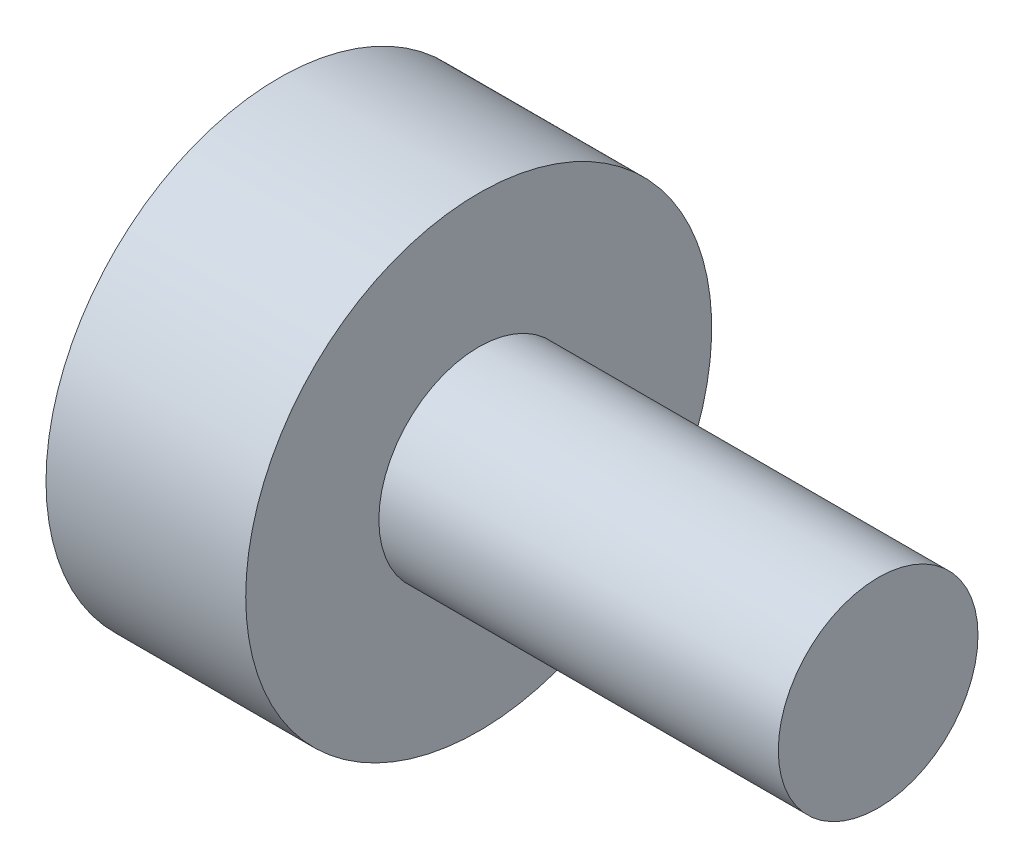
ISO-10303-21;
HEADER;
FILE_DESCRIPTION(('STEP AP214'),'2;1');
FILE_NAME('part.step','',(''),(''),'','','');
FILE_SCHEMA(('AUTOMOTIVE_DESIGN { 1 0 10303 214 1 1 1 1 }'));
ENDSEC;
DATA;
#1=APPLICATION_CONTEXT('core data for automotive mechanical design processes');
#2=APPLICATION_PROTOCOL_DEFINITION('international standard','automotive_design',2000,#1);
#3=PRODUCT_CONTEXT('',#1,'mechanical');
#4=PRODUCT('Part','Part','',(#3));
#5=PRODUCT_RELATED_PRODUCT_CATEGORY('part','',(#4));
#6=PRODUCT_DEFINITION_FORMATION('','',#4);
#7=PRODUCT_DEFINITION_CONTEXT('part definition',#1,'design');
#8=PRODUCT_DEFINITION('design','',#6,#7);
#9=PRODUCT_DEFINITION_SHAPE('','',#8);
#10=(LENGTH_UNIT() NAMED_UNIT(*) SI_UNIT(.MILLI.,.METRE.));
#11=(NAMED_UNIT(*) PLANE_ANGLE_UNIT() SI_UNIT($,.RADIAN.));
#12=(NAMED_UNIT(*) SI_UNIT($,.STERADIAN.) SOLID_ANGLE_UNIT());
#13=UNCERTAINTY_MEASURE_WITH_UNIT(LENGTH_MEASURE(1.E-05),#10,'distance_accuracy_value','');
#14=(GEOMETRIC_REPRESENTATION_CONTEXT(3) GLOBAL_UNCERTAINTY_ASSIGNED_CONTEXT((#13)) GLOBAL_UNIT_ASSIGNED_CONTEXT((#10,
#11,#12)) REPRESENTATION_CONTEXT('',''));
#15=CARTESIAN_POINT('',(0.,0.,0.));
#16=DIRECTION('',(0.,0.,1.));
#17=DIRECTION('',(1.,0.,0.));
#18=AXIS2_PLACEMENT_3D('',#15,#16,#17);
#19=CARTESIAN_POINT('',(0.,0.,0.));
#20=DIRECTION('',(1.,0.,0.));
#21=DIRECTION('',(0.,0.,-1.));
#22=AXIS2_PLACEMENT_3D('',#19,#20,#21);
#23=PLANE('',#22);
#24=CARTESIAN_POINT('',(0.,0.,0.));
#25=DIRECTION('',(1.,0.,0.));
#26=DIRECTION('',(0.,0.,-1.));
#27=AXIS2_PLACEMENT_3D('',#24,#25,#26);
#28=CIRCLE('',#27,4.25);
#29=CARTESIAN_POINT('',(0.,0.,-4.25));
#30=VERTEX_POINT('',#29);
#31=EDGE_CURVE('E65',#30,#30,#28,.T.);
#32=ORIENTED_EDGE('',*,*,#31,.T.);
#33=EDGE_LOOP('',(#32));
#34=FACE_BOUND('',#33,.T.);
#35=CARTESIAN_POINT('',(0.,0.,0.));
#36=DIRECTION('',(-1.,0.,0.));
#37=DIRECTION('',(0.,0.,1.));
#38=AXIS2_PLACEMENT_3D('',#35,#36,#37);
#39=CIRCLE('',#38,20.);
#40=CARTESIAN_POINT('',(0.,0.,20.));
#41=VERTEX_POINT('',#40);
#42=EDGE_CURVE('E10',#41,#41,#39,.T.);
#43=ORIENTED_EDGE('',*,*,#42,.T.);
#44=EDGE_LOOP('',(#43));
#45=FACE_BOUND('',#44,.T.);
#46=ADVANCED_FACE('F39',(#34,#45),#23,.F.);
#47=CARTESIAN_POINT('',(0.,0.,0.));
#48=DIRECTION('',(-1.,0.,0.));
#49=DIRECTION('',(0.,0.,1.));
#50=AXIS2_PLACEMENT_3D('',#47,#48,#49);
#51=CYLINDRICAL_SURFACE('',#50,20.);
#52=ORIENTED_EDGE('',*,*,#42,.F.);
#53=EDGE_LOOP('',(#52));
#54=FACE_BOUND('',#53,.T.);
#55=CARTESIAN_POINT('',(10.,0.,0.));
#56=DIRECTION('',(-1.,0.,0.));
#57=DIRECTION('',(0.,0.,1.));
#58=AXIS2_PLACEMENT_3D('',#55,#56,#57);
#59=CIRCLE('',#58,20.);
#60=CARTESIAN_POINT('',(10.,0.,20.));
#61=VERTEX_POINT('',#60);
#62=EDGE_CURVE('E45',#61,#61,#59,.T.);
#63=ORIENTED_EDGE('',*,*,#62,.T.);
#64=EDGE_LOOP('',(#63));
#65=FACE_BOUND('',#64,.T.);
#66=ADVANCED_FACE('F84',(#54,#65),#51,.T.);
#67=CARTESIAN_POINT('',(10.,20.,0.));
#68=DIRECTION('',(1.,0.,0.));
#69=DIRECTION('',(0.,0.,-1.));
#70=AXIS2_PLACEMENT_3D('',#67,#68,#69);
#71=PLANE('',#70);
#72=ORIENTED_EDGE('',*,*,#62,.F.);
#73=EDGE_LOOP('',(#72));
#74=FACE_BOUND('',#73,.T.);
#75=CARTESIAN_POINT('',(10.,0.,0.));
#76=DIRECTION('',(-1.,0.,0.));
#77=DIRECTION('',(0.,0.,1.));
#78=AXIS2_PLACEMENT_3D('',#75,#76,#77);
#79=CIRCLE('',#78,35.);
#80=CARTESIAN_POINT('',(10.,0.,35.));
#81=VERTEX_POINT('',#80);
#82=EDGE_CURVE('E49',#81,#81,#79,.T.);
#83=ORIENTED_EDGE('',*,*,#82,.T.);
#84=EDGE_LOOP('',(#83));
#85=FACE_BOUND('',#84,.T.);
#86=ADVANCED_FACE('F90',(#74,#85),#71,.F.);
#87=CARTESIAN_POINT('',(0.,0.,0.));
#88=DIRECTION('',(-1.,0.,0.));
#89=DIRECTION('',(0.,0.,1.));
#90=AXIS2_PLACEMENT_3D('',#87,#88,#89);
#91=CYLINDRICAL_SURFACE('',#90,35.);
#92=ORIENTED_EDGE('',*,*,#82,.F.);
#93=EDGE_LOOP('',(#92));
#94=FACE_BOUND('',#93,.T.);
#95=CARTESIAN_POINT('',(40.,0.,0.));
#96=DIRECTION('',(-1.,0.,0.));
#97=DIRECTION('',(0.,0.,1.));
#98=AXIS2_PLACEMENT_3D('',#95,#96,#97);
#99=CIRCLE('',#98,35.);
#100=CARTESIAN_POINT('',(40.,0.,35.));
#101=VERTEX_POINT('',#100);
#102=EDGE_CURVE('E53',#101,#101,#99,.T.);
#103=ORIENTED_EDGE('',*,*,#102,.T.);
#104=EDGE_LOOP('',(#103));
#105=FACE_BOUND('',#104,.T.);
#106=ADVANCED_FACE('F96',(#94,#105),#91,.T.);
#107=CARTESIAN_POINT('',(40.,35.,0.));
#108=DIRECTION('',(-1.,0.,0.));
#109=DIRECTION('',(0.,0.,1.));
#110=AXIS2_PLACEMENT_3D('',#107,#108,#109);
#111=PLANE('',#110);
#112=ORIENTED_EDGE('',*,*,#102,.F.);
#113=EDGE_LOOP('',(#112));
#114=FACE_BOUND('',#113,.T.);
#115=CARTESIAN_POINT('',(40.,0.,0.));
#116=DIRECTION('',(-1.,0.,0.));
#117=DIRECTION('',(0.,0.,1.));
#118=AXIS2_PLACEMENT_3D('',#115,#116,#117);
#119=CIRCLE('',#118,15.);
#120=CARTESIAN_POINT('',(40.,0.,15.));
#121=VERTEX_POINT('',#120);
#122=EDGE_CURVE('E58',#121,#121,#119,.T.);
#123=ORIENTED_EDGE('',*,*,#122,.T.);
#124=EDGE_LOOP('',(#123));
#125=FACE_BOUND('',#124,.T.);
#126=ADVANCED_FACE('F102',(#114,#125),#111,.F.);
#127=CARTESIAN_POINT('',(0.,0.,0.));
#128=DIRECTION('',(-1.,0.,0.));
#129=DIRECTION('',(0.,0.,1.));
#130=AXIS2_PLACEMENT_3D('',#127,#128,#129);
#131=CYLINDRICAL_SURFACE('',#130,15.);
#132=ORIENTED_EDGE('',*,*,#122,.F.);
#133=EDGE_LOOP('',(#132));
#134=FACE_BOUND('',#133,.T.);
#135=CARTESIAN_POINT('',(100.,0.,0.));
#136=DIRECTION('',(-1.,0.,0.));
#137=DIRECTION('',(0.,0.,1.));
#138=AXIS2_PLACEMENT_3D('',#135,#136,#137);
#139=CIRCLE('',#138,15.);
#140=CARTESIAN_POINT('',(100.,0.,15.));
#141=VERTEX_POINT('',#140);
#142=EDGE_CURVE('E61',#141,#141,#139,.T.);
#143=ORIENTED_EDGE('',*,*,#142,.T.);
#144=EDGE_LOOP('',(#143));
#145=FACE_BOUND('',#144,.T.);
#146=ADVANCED_FACE('F106',(#134,#145),#131,.T.);
#147=CARTESIAN_POINT('',(100.,0.,0.));
#148=DIRECTION('',(-1.,0.,0.));
#149=DIRECTION('',(0.,0.,1.));
#150=AXIS2_PLACEMENT_3D('',#147,#148,#149);
#151=PLANE('',#150);
#152=ORIENTED_EDGE('',*,*,#142,.F.);
#153=EDGE_LOOP('',(#152));
#154=FACE_BOUND('',#153,.T.);
#155=ADVANCED_FACE('F81',(#154),#151,.F.);
#156=CARTESIAN_POINT('',(20.,0.,0.));
#157=DIRECTION('',(-1.,0.,0.));
#158=DIRECTION('',(0.,0.,1.));
#159=AXIS2_PLACEMENT_3D('',#156,#157,#158);
#160=CYLINDRICAL_SURFACE('',#159,4.25);
#161=CARTESIAN_POINT('',(20.,0.,0.));
#162=DIRECTION('',(1.,0.,0.));
#163=DIRECTION('',(0.,0.,-1.));
#164=AXIS2_PLACEMENT_3D('',#161,#162,#163);
#165=CIRCLE('',#164,4.25);
#166=CARTESIAN_POINT('',(20.,0.,-4.25));
#167=VERTEX_POINT('',#166);
#168=EDGE_CURVE('E64',#167,#167,#165,.T.);
#169=ORIENTED_EDGE('',*,*,#168,.T.);
#170=EDGE_LOOP('',(#169));
#171=FACE_BOUND('',#170,.T.);
#172=ORIENTED_EDGE('',*,*,#31,.F.);
#173=EDGE_LOOP('',(#172));
#174=FACE_BOUND('',#173,.T.);
#175=ADVANCED_FACE('F72',(#171,#174),#160,.F.);
#176=CARTESIAN_POINT('',(20.,0.,0.));
#177=DIRECTION('',(1.,0.,0.));
#178=DIRECTION('',(0.,0.,-1.));
#179=AXIS2_PLACEMENT_3D('',#176,#177,#178);
#180=PLANE('',#179);
#181=ORIENTED_EDGE('',*,*,#168,.F.);
#182=EDGE_LOOP('',(#181));
#183=FACE_BOUND('',#182,.T.);
#184=ADVANCED_FACE('F75',(#183),#180,.F.);
#185=CLOSED_SHELL('',(#46,#66,#86,#106,#126,#146,#155,#175,#184));
#186=MANIFOLD_SOLID_BREP('B2',#185);
#187=ADVANCED_BREP_SHAPE_REPRESENTATION('',(#18,#186),#14);
#188=SHAPE_DEFINITION_REPRESENTATION(#9,#187);
ENDSEC;
END-ISO-10303-21;
